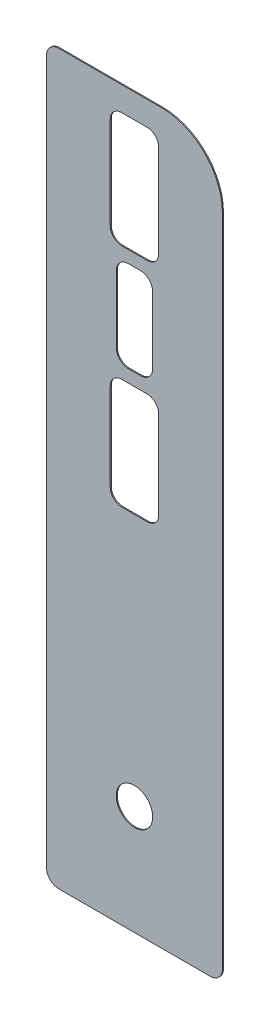
ISO-10303-21;
HEADER;
FILE_DESCRIPTION(('STEP AP214'),'2;1');
FILE_NAME('part.step','',(''),(''),'','','');
FILE_SCHEMA(('AUTOMOTIVE_DESIGN { 1 0 10303 214 1 1 1 1 }'));
ENDSEC;
DATA;
#1=APPLICATION_CONTEXT('core data for automotive mechanical design processes');
#2=APPLICATION_PROTOCOL_DEFINITION('international standard','automotive_design',2000,#1);
#3=PRODUCT_CONTEXT('',#1,'mechanical');
#4=PRODUCT('Part','Part','',(#3));
#5=PRODUCT_RELATED_PRODUCT_CATEGORY('part','',(#4));
#6=PRODUCT_DEFINITION_FORMATION('','',#4);
#7=PRODUCT_DEFINITION_CONTEXT('part definition',#1,'design');
#8=PRODUCT_DEFINITION('design','',#6,#7);
#9=PRODUCT_DEFINITION_SHAPE('','',#8);
#10=(LENGTH_UNIT() NAMED_UNIT(*) SI_UNIT(.MILLI.,.METRE.));
#11=(NAMED_UNIT(*) PLANE_ANGLE_UNIT() SI_UNIT($,.RADIAN.));
#12=(NAMED_UNIT(*) SI_UNIT($,.STERADIAN.) SOLID_ANGLE_UNIT());
#13=UNCERTAINTY_MEASURE_WITH_UNIT(LENGTH_MEASURE(1.E-05),#10,'distance_accuracy_value','');
#14=(GEOMETRIC_REPRESENTATION_CONTEXT(3) GLOBAL_UNCERTAINTY_ASSIGNED_CONTEXT((#13)) GLOBAL_UNIT_ASSIGNED_CONTEXT((#10,
#11,#12)) REPRESENTATION_CONTEXT('',''));
#15=CARTESIAN_POINT('',(0.,0.,0.));
#16=DIRECTION('',(0.,0.,1.));
#17=DIRECTION('',(1.,0.,0.));
#18=AXIS2_PLACEMENT_3D('',#15,#16,#17);
#19=CARTESIAN_POINT('',(12.5,-58.,0.17));
#20=DIRECTION('',(0.,0.,-1.));
#21=DIRECTION('',(-1.,0.,0.));
#22=AXIS2_PLACEMENT_3D('',#19,#20,#21);
#23=CYLINDRICAL_SURFACE('',#22,2.);
#24=CARTESIAN_POINT('',(12.5,-58.,0.));
#25=DIRECTION('',(0.,0.,1.));
#26=DIRECTION('',(1.,0.,0.));
#27=AXIS2_PLACEMENT_3D('',#24,#25,#26);
#28=CIRCLE('',#27,2.);
#29=CARTESIAN_POINT('',(12.5,-60.,0.));
#30=VERTEX_POINT('',#29);
#31=CARTESIAN_POINT('',(14.5,-58.,0.));
#32=VERTEX_POINT('',#31);
#33=EDGE_CURVE('E321',#30,#32,#28,.T.);
#34=ORIENTED_EDGE('',*,*,#33,.T.);
#35=DIRECTION('',(0.,0.,-1.));
#36=VECTOR('',#35,1.);
#37=CARTESIAN_POINT('',(14.5,-58.,0.17));
#38=LINE('',#37,#36);
#39=CARTESIAN_POINT('',(14.5,-58.,0.17));
#40=VERTEX_POINT('',#39);
#41=EDGE_CURVE('E11',#40,#32,#38,.T.);
#42=ORIENTED_EDGE('',*,*,#41,.F.);
#43=CARTESIAN_POINT('',(12.5,-58.,0.17));
#44=DIRECTION('',(0.,0.,1.));
#45=DIRECTION('',(1.,0.,0.));
#46=AXIS2_PLACEMENT_3D('',#43,#44,#45);
#47=CIRCLE('',#46,2.);
#48=CARTESIAN_POINT('',(12.5,-60.,0.17));
#49=VERTEX_POINT('',#48);
#50=EDGE_CURVE('E452',#49,#40,#47,.T.);
#51=ORIENTED_EDGE('',*,*,#50,.F.);
#52=DIRECTION('',(0.,0.,-1.));
#53=VECTOR('',#52,1.);
#54=CARTESIAN_POINT('',(12.5,-60.,0.17));
#55=LINE('',#54,#53);
#56=EDGE_CURVE('E470',#49,#30,#55,.T.);
#57=ORIENTED_EDGE('',*,*,#56,.T.);
#58=EDGE_LOOP('',(#34,#42,#51,#57));
#59=FACE_BOUND('',#58,.T.);
#60=ADVANCED_FACE('F41',(#59),#23,.T.);
#61=CARTESIAN_POINT('',(14.5,50.,0.17));
#62=DIRECTION('',(-1.,0.,0.));
#63=DIRECTION('',(0.,-1.,0.));
#64=AXIS2_PLACEMENT_3D('',#61,#62,#63);
#65=PLANE('',#64);
#66=DIRECTION('',(0.,1.,0.));
#67=VECTOR('',#66,1.);
#68=CARTESIAN_POINT('',(14.5,50.,0.));
#69=LINE('',#68,#67);
#70=CARTESIAN_POINT('',(14.5,50.,0.));
#71=VERTEX_POINT('',#70);
#72=EDGE_CURVE('E473',#32,#71,#69,.T.);
#73=ORIENTED_EDGE('',*,*,#72,.T.);
#74=DIRECTION('',(0.,0.,-1.));
#75=VECTOR('',#74,1.);
#76=CARTESIAN_POINT('',(14.5,50.,0.17));
#77=LINE('',#76,#75);
#78=CARTESIAN_POINT('',(14.5,50.,0.17));
#79=VERTEX_POINT('',#78);
#80=EDGE_CURVE('E48',#79,#71,#77,.T.);
#81=ORIENTED_EDGE('',*,*,#80,.F.);
#82=DIRECTION('',(0.,1.,0.));
#83=VECTOR('',#82,1.);
#84=CARTESIAN_POINT('',(14.5,50.,0.17));
#85=LINE('',#84,#83);
#86=EDGE_CURVE('E455',#40,#79,#85,.T.);
#87=ORIENTED_EDGE('',*,*,#86,.F.);
#88=ORIENTED_EDGE('',*,*,#41,.T.);
#89=EDGE_LOOP('',(#73,#81,#87,#88));
#90=FACE_BOUND('',#89,.T.);
#91=ADVANCED_FACE('F529',(#90),#65,.F.);
#92=CARTESIAN_POINT('',(4.5,50.,0.17));
#93=DIRECTION('',(0.,0.,-1.));
#94=DIRECTION('',(-1.,0.,0.));
#95=AXIS2_PLACEMENT_3D('',#92,#93,#94);
#96=CYLINDRICAL_SURFACE('',#95,10.);
#97=CARTESIAN_POINT('',(4.5,50.,0.));
#98=DIRECTION('',(0.,0.,1.));
#99=DIRECTION('',(-1.,0.,0.));
#100=AXIS2_PLACEMENT_3D('',#97,#98,#99);
#101=CIRCLE('',#100,10.);
#102=CARTESIAN_POINT('',(4.5,60.,0.));
#103=VERTEX_POINT('',#102);
#104=EDGE_CURVE('E475',#71,#103,#101,.T.);
#105=ORIENTED_EDGE('',*,*,#104,.T.);
#106=DIRECTION('',(0.,0.,-1.));
#107=VECTOR('',#106,1.);
#108=CARTESIAN_POINT('',(4.5,60.,0.17));
#109=LINE('',#108,#107);
#110=CARTESIAN_POINT('',(4.5,60.,0.17));
#111=VERTEX_POINT('',#110);
#112=EDGE_CURVE('E500',#111,#103,#109,.T.);
#113=ORIENTED_EDGE('',*,*,#112,.F.);
#114=CARTESIAN_POINT('',(4.5,50.,0.17));
#115=DIRECTION('',(0.,0.,1.));
#116=DIRECTION('',(-1.,0.,0.));
#117=AXIS2_PLACEMENT_3D('',#114,#115,#116);
#118=CIRCLE('',#117,10.);
#119=EDGE_CURVE('E458',#79,#111,#118,.T.);
#120=ORIENTED_EDGE('',*,*,#119,.F.);
#121=ORIENTED_EDGE('',*,*,#80,.T.);
#122=EDGE_LOOP('',(#105,#113,#120,#121));
#123=FACE_BOUND('',#122,.T.);
#124=ADVANCED_FACE('F507',(#123),#96,.T.);
#125=CARTESIAN_POINT('',(-12.5,60.,0.17));
#126=DIRECTION('',(0.,-1.,0.));
#127=DIRECTION('',(1.,0.,0.));
#128=AXIS2_PLACEMENT_3D('',#125,#126,#127);
#129=PLANE('',#128);
#130=DIRECTION('',(-1.,0.,0.));
#131=VECTOR('',#130,1.);
#132=CARTESIAN_POINT('',(-12.5,60.,0.));
#133=LINE('',#132,#131);
#134=CARTESIAN_POINT('',(-12.5,60.,0.));
#135=VERTEX_POINT('',#134);
#136=EDGE_CURVE('E477',#103,#135,#133,.T.);
#137=ORIENTED_EDGE('',*,*,#136,.T.);
#138=DIRECTION('',(0.,0.,-1.));
#139=VECTOR('',#138,1.);
#140=CARTESIAN_POINT('',(-12.5,60.,0.17));
#141=LINE('',#140,#139);
#142=CARTESIAN_POINT('',(-12.5,60.,0.17));
#143=VERTEX_POINT('',#142);
#144=EDGE_CURVE('E497',#143,#135,#141,.T.);
#145=ORIENTED_EDGE('',*,*,#144,.F.);
#146=DIRECTION('',(-1.,0.,0.));
#147=VECTOR('',#146,1.);
#148=CARTESIAN_POINT('',(-12.5,60.,0.17));
#149=LINE('',#148,#147);
#150=EDGE_CURVE('E460',#111,#143,#149,.T.);
#151=ORIENTED_EDGE('',*,*,#150,.F.);
#152=ORIENTED_EDGE('',*,*,#112,.T.);
#153=EDGE_LOOP('',(#137,#145,#151,#152));
#154=FACE_BOUND('',#153,.T.);
#155=ADVANCED_FACE('F517',(#154),#129,.F.);
#156=CARTESIAN_POINT('',(-12.5,58.,0.17));
#157=DIRECTION('',(0.,0.,-1.));
#158=DIRECTION('',(-1.,0.,0.));
#159=AXIS2_PLACEMENT_3D('',#156,#157,#158);
#160=CYLINDRICAL_SURFACE('',#159,2.);
#161=CARTESIAN_POINT('',(-12.5,58.,0.));
#162=DIRECTION('',(0.,0.,1.));
#163=DIRECTION('',(1.,0.,0.));
#164=AXIS2_PLACEMENT_3D('',#161,#162,#163);
#165=CIRCLE('',#164,2.);
#166=CARTESIAN_POINT('',(-14.5,58.,0.));
#167=VERTEX_POINT('',#166);
#168=EDGE_CURVE('E479',#135,#167,#165,.T.);
#169=ORIENTED_EDGE('',*,*,#168,.T.);
#170=DIRECTION('',(0.,0.,-1.));
#171=VECTOR('',#170,1.);
#172=CARTESIAN_POINT('',(-14.5,58.,0.17));
#173=LINE('',#172,#171);
#174=CARTESIAN_POINT('',(-14.5,58.,0.17));
#175=VERTEX_POINT('',#174);
#176=EDGE_CURVE('E494',#175,#167,#173,.T.);
#177=ORIENTED_EDGE('',*,*,#176,.F.);
#178=CARTESIAN_POINT('',(-12.5,58.,0.17));
#179=DIRECTION('',(0.,0.,1.));
#180=DIRECTION('',(1.,0.,0.));
#181=AXIS2_PLACEMENT_3D('',#178,#179,#180);
#182=CIRCLE('',#181,2.);
#183=EDGE_CURVE('E462',#143,#175,#182,.T.);
#184=ORIENTED_EDGE('',*,*,#183,.F.);
#185=ORIENTED_EDGE('',*,*,#144,.T.);
#186=EDGE_LOOP('',(#169,#177,#184,#185));
#187=FACE_BOUND('',#186,.T.);
#188=ADVANCED_FACE('F521',(#187),#160,.T.);
#189=CARTESIAN_POINT('',(-14.5,58.,0.17));
#190=DIRECTION('',(1.,0.,0.));
#191=DIRECTION('',(0.,1.,0.));
#192=AXIS2_PLACEMENT_3D('',#189,#190,#191);
#193=PLANE('',#192);
#194=DIRECTION('',(0.,-1.,0.));
#195=VECTOR('',#194,1.);
#196=CARTESIAN_POINT('',(-14.5,58.,0.));
#197=LINE('',#196,#195);
#198=CARTESIAN_POINT('',(-14.5,-58.,0.));
#199=VERTEX_POINT('',#198);
#200=EDGE_CURVE('E481',#167,#199,#197,.T.);
#201=ORIENTED_EDGE('',*,*,#200,.T.);
#202=DIRECTION('',(0.,0.,-1.));
#203=VECTOR('',#202,1.);
#204=CARTESIAN_POINT('',(-14.5,-58.,0.17));
#205=LINE('',#204,#203);
#206=CARTESIAN_POINT('',(-14.5,-58.,0.17));
#207=VERTEX_POINT('',#206);
#208=EDGE_CURVE('E491',#207,#199,#205,.T.);
#209=ORIENTED_EDGE('',*,*,#208,.F.);
#210=DIRECTION('',(0.,-1.,0.));
#211=VECTOR('',#210,1.);
#212=CARTESIAN_POINT('',(-14.5,58.,0.17));
#213=LINE('',#212,#211);
#214=EDGE_CURVE('E464',#175,#207,#213,.T.);
#215=ORIENTED_EDGE('',*,*,#214,.F.);
#216=ORIENTED_EDGE('',*,*,#176,.T.);
#217=EDGE_LOOP('',(#201,#209,#215,#216));
#218=FACE_BOUND('',#217,.T.);
#219=ADVANCED_FACE('F542',(#218),#193,.F.);
#220=CARTESIAN_POINT('',(-12.5,-58.,0.17));
#221=DIRECTION('',(0.,0.,-1.));
#222=DIRECTION('',(-1.,0.,0.));
#223=AXIS2_PLACEMENT_3D('',#220,#221,#222);
#224=CYLINDRICAL_SURFACE('',#223,2.);
#225=CARTESIAN_POINT('',(-12.5,-58.,0.));
#226=DIRECTION('',(0.,0.,1.));
#227=DIRECTION('',(1.,0.,0.));
#228=AXIS2_PLACEMENT_3D('',#225,#226,#227);
#229=CIRCLE('',#228,2.);
#230=CARTESIAN_POINT('',(-12.5,-60.,0.));
#231=VERTEX_POINT('',#230);
#232=EDGE_CURVE('E483',#199,#231,#229,.T.);
#233=ORIENTED_EDGE('',*,*,#232,.T.);
#234=DIRECTION('',(0.,0.,-1.));
#235=VECTOR('',#234,1.);
#236=CARTESIAN_POINT('',(-12.5,-60.,0.17));
#237=LINE('',#236,#235);
#238=CARTESIAN_POINT('',(-12.5,-60.,0.17));
#239=VERTEX_POINT('',#238);
#240=EDGE_CURVE('E488',#239,#231,#237,.T.);
#241=ORIENTED_EDGE('',*,*,#240,.F.);
#242=CARTESIAN_POINT('',(-12.5,-58.,0.17));
#243=DIRECTION('',(0.,0.,1.));
#244=DIRECTION('',(1.,0.,0.));
#245=AXIS2_PLACEMENT_3D('',#242,#243,#244);
#246=CIRCLE('',#245,2.);
#247=EDGE_CURVE('E466',#207,#239,#246,.T.);
#248=ORIENTED_EDGE('',*,*,#247,.F.);
#249=ORIENTED_EDGE('',*,*,#208,.T.);
#250=EDGE_LOOP('',(#233,#241,#248,#249));
#251=FACE_BOUND('',#250,.T.);
#252=ADVANCED_FACE('F540',(#251),#224,.T.);
#253=CARTESIAN_POINT('',(-12.5,-60.,0.17));
#254=DIRECTION('',(0.,1.,0.));
#255=DIRECTION('',(-1.,0.,0.));
#256=AXIS2_PLACEMENT_3D('',#253,#254,#255);
#257=PLANE('',#256);
#258=DIRECTION('',(1.,0.,0.));
#259=VECTOR('',#258,1.);
#260=CARTESIAN_POINT('',(-12.5,-60.,0.));
#261=LINE('',#260,#259);
#262=EDGE_CURVE('E456',#231,#30,#261,.T.);
#263=ORIENTED_EDGE('',*,*,#262,.T.);
#264=ORIENTED_EDGE('',*,*,#56,.F.);
#265=DIRECTION('',(1.,0.,0.));
#266=VECTOR('',#265,1.);
#267=CARTESIAN_POINT('',(-12.5,-60.,0.17));
#268=LINE('',#267,#266);
#269=EDGE_CURVE('E468',#239,#49,#268,.T.);
#270=ORIENTED_EDGE('',*,*,#269,.F.);
#271=ORIENTED_EDGE('',*,*,#240,.T.);
#272=EDGE_LOOP('',(#263,#264,#270,#271));
#273=FACE_BOUND('',#272,.T.);
#274=ADVANCED_FACE('F535',(#273),#257,.F.);
#275=CARTESIAN_POINT('',(12.5,-58.,0.17));
#276=DIRECTION('',(0.,0.,1.));
#277=DIRECTION('',(1.,0.,0.));
#278=AXIS2_PLACEMENT_3D('',#275,#276,#277);
#279=PLANE('',#278);
#280=CARTESIAN_POINT('',(-1.,32.9999999999978,0.17));
#281=DIRECTION('',(0.,0.,1.));
#282=DIRECTION('',(1.,0.,0.));
#283=AXIS2_PLACEMENT_3D('',#280,#281,#282);
#284=CIRCLE('',#283,2.);
#285=CARTESIAN_POINT('',(-0.999999999999985,34.9999999999978,0.17));
#286=VERTEX_POINT('',#285);
#287=CARTESIAN_POINT('',(-3.,32.9999999999978,0.17));
#288=VERTEX_POINT('',#287);
#289=EDGE_CURVE('E55',#286,#288,#284,.T.);
#290=ORIENTED_EDGE('',*,*,#289,.F.);
#291=DIRECTION('',(-1.,0.,0.));
#292=VECTOR('',#291,1.);
#293=CARTESIAN_POINT('',(0.999999999999986,34.9999999999978,0.17));
#294=LINE('',#293,#292);
#295=CARTESIAN_POINT('',(0.999999999999986,34.9999999999978,0.17));
#296=VERTEX_POINT('',#295);
#297=EDGE_CURVE('E268',#296,#286,#294,.T.);
#298=ORIENTED_EDGE('',*,*,#297,.F.);
#299=CARTESIAN_POINT('',(1.,32.9999999999978,0.17));
#300=DIRECTION('',(0.,0.,1.));
#301=DIRECTION('',(1.,0.,0.));
#302=AXIS2_PLACEMENT_3D('',#299,#300,#301);
#303=CIRCLE('',#302,2.);
#304=CARTESIAN_POINT('',(3.,32.9999999999978,0.17));
#305=VERTEX_POINT('',#304);
#306=EDGE_CURVE('E271',#305,#296,#303,.T.);
#307=ORIENTED_EDGE('',*,*,#306,.F.);
#308=DIRECTION('',(0.,1.,0.));
#309=VECTOR('',#308,1.);
#310=CARTESIAN_POINT('',(3.,22.,0.17));
#311=LINE('',#310,#309);
#312=CARTESIAN_POINT('',(3.,22.,0.17));
#313=VERTEX_POINT('',#312);
#314=EDGE_CURVE('E299',#313,#305,#311,.T.);
#315=ORIENTED_EDGE('',*,*,#314,.F.);
#316=CARTESIAN_POINT('',(1.,22.,0.17));
#317=DIRECTION('',(0.,0.,1.));
#318=DIRECTION('',(1.,0.,0.));
#319=AXIS2_PLACEMENT_3D('',#316,#317,#318);
#320=CIRCLE('',#319,2.);
#321=CARTESIAN_POINT('',(1.,20.,0.17));
#322=VERTEX_POINT('',#321);
#323=EDGE_CURVE('E296',#322,#313,#320,.T.);
#324=ORIENTED_EDGE('',*,*,#323,.F.);
#325=DIRECTION('',(1.,0.,0.));
#326=VECTOR('',#325,1.);
#327=CARTESIAN_POINT('',(-0.999999999999999,20.,0.17));
#328=LINE('',#327,#326);
#329=CARTESIAN_POINT('',(-0.999999999999999,20.,0.17));
#330=VERTEX_POINT('',#329);
#331=EDGE_CURVE('E293',#330,#322,#328,.T.);
#332=ORIENTED_EDGE('',*,*,#331,.F.);
#333=CARTESIAN_POINT('',(-0.999999999999998,22.,0.17));
#334=DIRECTION('',(0.,0.,1.));
#335=DIRECTION('',(1.,0.,0.));
#336=AXIS2_PLACEMENT_3D('',#333,#334,#335);
#337=CIRCLE('',#336,2.);
#338=CARTESIAN_POINT('',(-3.,22.,0.17));
#339=VERTEX_POINT('',#338);
#340=EDGE_CURVE('E290',#339,#330,#337,.T.);
#341=ORIENTED_EDGE('',*,*,#340,.F.);
#342=DIRECTION('',(0.,-1.,0.));
#343=VECTOR('',#342,1.);
#344=CARTESIAN_POINT('',(-3.,32.9999999999978,0.17));
#345=LINE('',#344,#343);
#346=EDGE_CURVE('E288',#288,#339,#345,.T.);
#347=ORIENTED_EDGE('',*,*,#346,.F.);
#348=EDGE_LOOP('',(#290,#298,#307,#315,#324,#332,#341,#347));
#349=FACE_BOUND('',#348,.T.);
#350=CARTESIAN_POINT('',(0.,-42.,0.17));
#351=DIRECTION('',(0.,0.,1.));
#352=DIRECTION('',(1.,0.,0.));
#353=AXIS2_PLACEMENT_3D('',#350,#351,#352);
#354=CIRCLE('',#353,3.);
#355=CARTESIAN_POINT('',(3.,-42.,0.17));
#356=VERTEX_POINT('',#355);
#357=EDGE_CURVE('E322',#356,#356,#354,.T.);
#358=ORIENTED_EDGE('',*,*,#357,.F.);
#359=EDGE_LOOP('',(#358));
#360=FACE_BOUND('',#359,.T.);
#361=CARTESIAN_POINT('',(2.10000000000001,1.6,0.17));
#362=DIRECTION('',(0.,0.,1.));
#363=DIRECTION('',(1.,0.,0.));
#364=AXIS2_PLACEMENT_3D('',#361,#362,#363);
#365=CIRCLE('',#364,1.9);
#366=CARTESIAN_POINT('',(2.10000000000001,-0.3,0.17));
#367=VERTEX_POINT('',#366);
#368=CARTESIAN_POINT('',(4.00000000000001,1.6,0.17));
#369=VERTEX_POINT('',#368);
#370=EDGE_CURVE('E325',#367,#369,#365,.T.);
#371=ORIENTED_EDGE('',*,*,#370,.F.);
#372=DIRECTION('',(1.,0.,0.));
#373=VECTOR('',#372,1.);
#374=CARTESIAN_POINT('',(-2.1,-0.3,0.17));
#375=LINE('',#374,#373);
#376=CARTESIAN_POINT('',(-2.1,-0.3,0.17));
#377=VERTEX_POINT('',#376);
#378=EDGE_CURVE('E345',#377,#367,#375,.T.);
#379=ORIENTED_EDGE('',*,*,#378,.F.);
#380=CARTESIAN_POINT('',(-2.1,1.6,0.17));
#381=DIRECTION('',(0.,0.,1.));
#382=DIRECTION('',(1.,0.,0.));
#383=AXIS2_PLACEMENT_3D('',#380,#381,#382);
#384=CIRCLE('',#383,1.9);
#385=CARTESIAN_POINT('',(-3.99999999999999,1.6,0.17));
#386=VERTEX_POINT('',#385);
#387=EDGE_CURVE('E348',#386,#377,#384,.T.);
#388=ORIENTED_EDGE('',*,*,#387,.F.);
#389=DIRECTION('',(0.,-1.,0.));
#390=VECTOR('',#389,1.);
#391=CARTESIAN_POINT('',(-4.,16.0318297738409,0.17));
#392=LINE('',#391,#390);
#393=CARTESIAN_POINT('',(-4.,16.0318297738409,0.17));
#394=VERTEX_POINT('',#393);
#395=EDGE_CURVE('E352',#394,#386,#392,.T.);
#396=ORIENTED_EDGE('',*,*,#395,.F.);
#397=CARTESIAN_POINT('',(-2.1,16.0318297738409,0.17));
#398=DIRECTION('',(0.,0.,1.));
#399=DIRECTION('',(1.,0.,0.));
#400=AXIS2_PLACEMENT_3D('',#397,#398,#399);
#401=CIRCLE('',#400,1.9);
#402=CARTESIAN_POINT('',(-2.1,17.9318297738409,0.17));
#403=VERTEX_POINT('',#402);
#404=EDGE_CURVE('E355',#403,#394,#401,.T.);
#405=ORIENTED_EDGE('',*,*,#404,.F.);
#406=DIRECTION('',(-1.,0.,0.));
#407=VECTOR('',#406,1.);
#408=CARTESIAN_POINT('',(2.10000000000001,17.9318297738409,0.17));
#409=LINE('',#408,#407);
#410=CARTESIAN_POINT('',(2.10000000000001,17.9318297738409,0.17));
#411=VERTEX_POINT('',#410);
#412=EDGE_CURVE('E358',#411,#403,#409,.T.);
#413=ORIENTED_EDGE('',*,*,#412,.F.);
#414=CARTESIAN_POINT('',(2.10000000000001,16.0318297738409,0.17));
#415=DIRECTION('',(0.,0.,1.));
#416=DIRECTION('',(1.,0.,0.));
#417=AXIS2_PLACEMENT_3D('',#414,#415,#416);
#418=CIRCLE('',#417,1.9);
#419=CARTESIAN_POINT('',(4.00000000000001,16.0318297738409,0.17));
#420=VERTEX_POINT('',#419);
#421=EDGE_CURVE('E361',#420,#411,#418,.T.);
#422=ORIENTED_EDGE('',*,*,#421,.F.);
#423=DIRECTION('',(0.,1.,0.));
#424=VECTOR('',#423,1.);
#425=CARTESIAN_POINT('',(4.00000000000001,1.6,0.17));
#426=LINE('',#425,#424);
#427=EDGE_CURVE('E364',#369,#420,#426,.T.);
#428=ORIENTED_EDGE('',*,*,#427,.F.);
#429=EDGE_LOOP('',(#371,#379,#388,#396,#405,#413,#422,#428));
#430=FACE_BOUND('',#429,.T.);
#431=CARTESIAN_POINT('',(2.1,54.1000000000022,0.17));
#432=DIRECTION('',(0.,0.,1.));
#433=DIRECTION('',(1.,0.,0.));
#434=AXIS2_PLACEMENT_3D('',#431,#432,#433);
#435=CIRCLE('',#434,1.9);
#436=CARTESIAN_POINT('',(4.00000000000001,54.1000000000022,0.17));
#437=VERTEX_POINT('',#436);
#438=CARTESIAN_POINT('',(2.1,56.0000000000022,0.17));
#439=VERTEX_POINT('',#438);
#440=EDGE_CURVE('E344',#437,#439,#435,.T.);
#441=ORIENTED_EDGE('',*,*,#440,.F.);
#442=DIRECTION('',(0.,1.,0.));
#443=VECTOR('',#442,1.);
#444=CARTESIAN_POINT('',(4.00000000000001,38.8999999999978,0.17));
#445=LINE('',#444,#443);
#446=CARTESIAN_POINT('',(4.,38.8999999999978,0.17));
#447=VERTEX_POINT('',#446);
#448=EDGE_CURVE('E407',#447,#437,#445,.T.);
#449=ORIENTED_EDGE('',*,*,#448,.F.);
#450=CARTESIAN_POINT('',(2.1,38.8999999999978,0.17));
#451=DIRECTION('',(0.,0.,1.));
#452=DIRECTION('',(1.,0.,0.));
#453=AXIS2_PLACEMENT_3D('',#450,#451,#452);
#454=CIRCLE('',#453,1.9);
#455=CARTESIAN_POINT('',(2.1,36.9999999999978,0.17));
#456=VERTEX_POINT('',#455);
#457=EDGE_CURVE('E410',#456,#447,#454,.T.);
#458=ORIENTED_EDGE('',*,*,#457,.F.);
#459=DIRECTION('',(1.,0.,0.));
#460=VECTOR('',#459,1.);
#461=CARTESIAN_POINT('',(-2.1,36.9999999999978,0.17));
#462=LINE('',#461,#460);
#463=CARTESIAN_POINT('',(-2.1,36.9999999999978,0.17));
#464=VERTEX_POINT('',#463);
#465=EDGE_CURVE('E414',#464,#456,#462,.T.);
#466=ORIENTED_EDGE('',*,*,#465,.F.);
#467=CARTESIAN_POINT('',(-2.1,38.8999999999978,0.17));
#468=DIRECTION('',(0.,0.,1.));
#469=DIRECTION('',(1.,0.,0.));
#470=AXIS2_PLACEMENT_3D('',#467,#468,#469);
#471=CIRCLE('',#470,1.9);
#472=CARTESIAN_POINT('',(-4.,38.8999999999978,0.17));
#473=VERTEX_POINT('',#472);
#474=EDGE_CURVE('E417',#473,#464,#471,.T.);
#475=ORIENTED_EDGE('',*,*,#474,.F.);
#476=DIRECTION('',(0.,-1.,0.));
#477=VECTOR('',#476,1.);
#478=CARTESIAN_POINT('',(-4.,54.1000000000022,0.17));
#479=LINE('',#478,#477);
#480=CARTESIAN_POINT('',(-4.,54.1000000000022,0.17));
#481=VERTEX_POINT('',#480);
#482=EDGE_CURVE('E420',#481,#473,#479,.T.);
#483=ORIENTED_EDGE('',*,*,#482,.F.);
#484=CARTESIAN_POINT('',(-2.1,54.1000000000022,0.17));
#485=DIRECTION('',(0.,0.,1.));
#486=DIRECTION('',(1.,0.,0.));
#487=AXIS2_PLACEMENT_3D('',#484,#485,#486);
#488=CIRCLE('',#487,1.9);
#489=CARTESIAN_POINT('',(-2.1,56.0000000000022,0.17));
#490=VERTEX_POINT('',#489);
#491=EDGE_CURVE('E423',#490,#481,#488,.T.);
#492=ORIENTED_EDGE('',*,*,#491,.F.);
#493=DIRECTION('',(-1.,0.,0.));
#494=VECTOR('',#493,1.);
#495=CARTESIAN_POINT('',(2.1,56.0000000000022,0.17));
#496=LINE('',#495,#494);
#497=EDGE_CURVE('E426',#439,#490,#496,.T.);
#498=ORIENTED_EDGE('',*,*,#497,.F.);
#499=EDGE_LOOP('',(#441,#449,#458,#466,#475,#483,#492,#498));
#500=FACE_BOUND('',#499,.T.);
#501=ORIENTED_EDGE('',*,*,#50,.T.);
#502=ORIENTED_EDGE('',*,*,#86,.T.);
#503=ORIENTED_EDGE('',*,*,#119,.T.);
#504=ORIENTED_EDGE('',*,*,#150,.T.);
#505=ORIENTED_EDGE('',*,*,#183,.T.);
#506=ORIENTED_EDGE('',*,*,#214,.T.);
#507=ORIENTED_EDGE('',*,*,#247,.T.);
#508=ORIENTED_EDGE('',*,*,#269,.T.);
#509=EDGE_LOOP('',(#501,#502,#503,#504,#505,#506,#507,#508));
#510=FACE_BOUND('',#509,.T.);
#511=ADVANCED_FACE('F525',(#349,#360,#430,#500,#510),#279,.T.);
#512=CARTESIAN_POINT('',(12.5,-58.,0.));
#513=DIRECTION('',(0.,0.,1.));
#514=DIRECTION('',(1.,0.,0.));
#515=AXIS2_PLACEMENT_3D('',#512,#513,#514);
#516=PLANE('',#515);
#517=DIRECTION('',(-1.,0.,0.));
#518=VECTOR('',#517,1.);
#519=CARTESIAN_POINT('',(0.999999999999986,34.9999999999978,0.));
#520=LINE('',#519,#518);
#521=CARTESIAN_POINT('',(0.999999999999986,34.9999999999978,0.));
#522=VERTEX_POINT('',#521);
#523=CARTESIAN_POINT('',(-0.999999999999985,34.9999999999978,0.));
#524=VERTEX_POINT('',#523);
#525=EDGE_CURVE('E257',#522,#524,#520,.T.);
#526=ORIENTED_EDGE('',*,*,#525,.T.);
#527=CARTESIAN_POINT('',(-1.,32.9999999999978,0.));
#528=DIRECTION('',(0.,0.,1.));
#529=DIRECTION('',(1.,0.,0.));
#530=AXIS2_PLACEMENT_3D('',#527,#528,#529);
#531=CIRCLE('',#530,2.);
#532=CARTESIAN_POINT('',(-3.,32.9999999999978,0.));
#533=VERTEX_POINT('',#532);
#534=EDGE_CURVE('E251',#524,#533,#531,.T.);
#535=ORIENTED_EDGE('',*,*,#534,.T.);
#536=DIRECTION('',(0.,-1.,0.));
#537=VECTOR('',#536,1.);
#538=CARTESIAN_POINT('',(-3.,32.9999999999978,0.));
#539=LINE('',#538,#537);
#540=CARTESIAN_POINT('',(-3.,22.,0.));
#541=VERTEX_POINT('',#540);
#542=EDGE_CURVE('E260',#533,#541,#539,.T.);
#543=ORIENTED_EDGE('',*,*,#542,.T.);
#544=CARTESIAN_POINT('',(-0.999999999999998,22.,0.));
#545=DIRECTION('',(0.,0.,1.));
#546=DIRECTION('',(1.,0.,0.));
#547=AXIS2_PLACEMENT_3D('',#544,#545,#546);
#548=CIRCLE('',#547,2.);
#549=CARTESIAN_POINT('',(-0.999999999999999,20.,0.));
#550=VERTEX_POINT('',#549);
#551=EDGE_CURVE('E63',#541,#550,#548,.T.);
#552=ORIENTED_EDGE('',*,*,#551,.T.);
#553=DIRECTION('',(1.,0.,0.));
#554=VECTOR('',#553,1.);
#555=CARTESIAN_POINT('',(-0.999999999999999,20.,0.));
#556=LINE('',#555,#554);
#557=CARTESIAN_POINT('',(1.,20.,0.));
#558=VERTEX_POINT('',#557);
#559=EDGE_CURVE('E275',#550,#558,#556,.T.);
#560=ORIENTED_EDGE('',*,*,#559,.T.);
#561=CARTESIAN_POINT('',(1.,22.,0.));
#562=DIRECTION('',(0.,0.,1.));
#563=DIRECTION('',(1.,0.,0.));
#564=AXIS2_PLACEMENT_3D('',#561,#562,#563);
#565=CIRCLE('',#564,2.);
#566=CARTESIAN_POINT('',(3.,22.,0.));
#567=VERTEX_POINT('',#566);
#568=EDGE_CURVE('E278',#558,#567,#565,.T.);
#569=ORIENTED_EDGE('',*,*,#568,.T.);
#570=DIRECTION('',(0.,1.,0.));
#571=VECTOR('',#570,1.);
#572=CARTESIAN_POINT('',(3.,22.,0.));
#573=LINE('',#572,#571);
#574=CARTESIAN_POINT('',(3.,32.9999999999978,0.));
#575=VERTEX_POINT('',#574);
#576=EDGE_CURVE('E281',#567,#575,#573,.T.);
#577=ORIENTED_EDGE('',*,*,#576,.T.);
#578=CARTESIAN_POINT('',(1.,32.9999999999978,0.));
#579=DIRECTION('',(0.,0.,1.));
#580=DIRECTION('',(1.,0.,0.));
#581=AXIS2_PLACEMENT_3D('',#578,#579,#580);
#582=CIRCLE('',#581,2.);
#583=EDGE_CURVE('E284',#575,#522,#582,.T.);
#584=ORIENTED_EDGE('',*,*,#583,.T.);
#585=EDGE_LOOP('',(#526,#535,#543,#552,#560,#569,#577,#584));
#586=FACE_BOUND('',#585,.T.);
#587=CARTESIAN_POINT('',(0.,-42.,0.));
#588=DIRECTION('',(0.,0.,1.));
#589=DIRECTION('',(1.,0.,0.));
#590=AXIS2_PLACEMENT_3D('',#587,#588,#589);
#591=CIRCLE('',#590,3.);
#592=CARTESIAN_POINT('',(3.,-42.,0.));
#593=VERTEX_POINT('',#592);
#594=EDGE_CURVE('E318',#593,#593,#591,.T.);
#595=ORIENTED_EDGE('',*,*,#594,.T.);
#596=EDGE_LOOP('',(#595));
#597=FACE_BOUND('',#596,.T.);
#598=DIRECTION('',(1.,0.,0.));
#599=VECTOR('',#598,1.);
#600=CARTESIAN_POINT('',(-2.1,-0.3,0.));
#601=LINE('',#600,#599);
#602=CARTESIAN_POINT('',(-2.1,-0.3,0.));
#603=VERTEX_POINT('',#602);
#604=CARTESIAN_POINT('',(2.10000000000001,-0.3,0.));
#605=VERTEX_POINT('',#604);
#606=EDGE_CURVE('E329',#603,#605,#601,.T.);
#607=ORIENTED_EDGE('',*,*,#606,.T.);
#608=CARTESIAN_POINT('',(2.10000000000001,1.6,0.));
#609=DIRECTION('',(0.,0.,1.));
#610=DIRECTION('',(1.,0.,0.));
#611=AXIS2_PLACEMENT_3D('',#608,#609,#610);
#612=CIRCLE('',#611,1.9);
#613=CARTESIAN_POINT('',(4.00000000000001,1.6,0.));
#614=VERTEX_POINT('',#613);
#615=EDGE_CURVE('E349',#605,#614,#612,.T.);
#616=ORIENTED_EDGE('',*,*,#615,.T.);
#617=DIRECTION('',(0.,1.,0.));
#618=VECTOR('',#617,1.);
#619=CARTESIAN_POINT('',(4.00000000000001,1.6,0.));
#620=LINE('',#619,#618);
#621=CARTESIAN_POINT('',(4.00000000000001,16.0318297738409,0.));
#622=VERTEX_POINT('',#621);
#623=EDGE_CURVE('E385',#614,#622,#620,.T.);
#624=ORIENTED_EDGE('',*,*,#623,.T.);
#625=CARTESIAN_POINT('',(2.10000000000001,16.0318297738409,0.));
#626=DIRECTION('',(0.,0.,1.));
#627=DIRECTION('',(1.,0.,0.));
#628=AXIS2_PLACEMENT_3D('',#625,#626,#627);
#629=CIRCLE('',#628,1.9);
#630=CARTESIAN_POINT('',(2.10000000000001,17.9318297738409,0.));
#631=VERTEX_POINT('',#630);
#632=EDGE_CURVE('E382',#622,#631,#629,.T.);
#633=ORIENTED_EDGE('',*,*,#632,.T.);
#634=DIRECTION('',(-1.,0.,0.));
#635=VECTOR('',#634,1.);
#636=CARTESIAN_POINT('',(2.10000000000001,17.9318297738409,0.));
#637=LINE('',#636,#635);
#638=CARTESIAN_POINT('',(-2.1,17.9318297738409,0.));
#639=VERTEX_POINT('',#638);
#640=EDGE_CURVE('E379',#631,#639,#637,.T.);
#641=ORIENTED_EDGE('',*,*,#640,.T.);
#642=CARTESIAN_POINT('',(-2.1,16.0318297738409,0.));
#643=DIRECTION('',(0.,0.,1.));
#644=DIRECTION('',(1.,0.,0.));
#645=AXIS2_PLACEMENT_3D('',#642,#643,#644);
#646=CIRCLE('',#645,1.9);
#647=CARTESIAN_POINT('',(-4.,16.0318297738409,0.));
#648=VERTEX_POINT('',#647);
#649=EDGE_CURVE('E376',#639,#648,#646,.T.);
#650=ORIENTED_EDGE('',*,*,#649,.T.);
#651=DIRECTION('',(0.,-1.,0.));
#652=VECTOR('',#651,1.);
#653=CARTESIAN_POINT('',(-4.,16.0318297738409,0.));
#654=LINE('',#653,#652);
#655=CARTESIAN_POINT('',(-3.99999999999999,1.6,0.));
#656=VERTEX_POINT('',#655);
#657=EDGE_CURVE('E373',#648,#656,#654,.T.);
#658=ORIENTED_EDGE('',*,*,#657,.T.);
#659=CARTESIAN_POINT('',(-2.1,1.6,0.));
#660=DIRECTION('',(0.,0.,1.));
#661=DIRECTION('',(1.,0.,0.));
#662=AXIS2_PLACEMENT_3D('',#659,#660,#661);
#663=CIRCLE('',#662,1.9);
#664=EDGE_CURVE('E370',#656,#603,#663,.T.);
#665=ORIENTED_EDGE('',*,*,#664,.T.);
#666=EDGE_LOOP('',(#607,#616,#624,#633,#641,#650,#658,#665));
#667=FACE_BOUND('',#666,.T.);
#668=DIRECTION('',(0.,1.,0.));
#669=VECTOR('',#668,1.);
#670=CARTESIAN_POINT('',(4.00000000000001,38.8999999999978,0.));
#671=LINE('',#670,#669);
#672=CARTESIAN_POINT('',(4.,38.8999999999978,0.));
#673=VERTEX_POINT('',#672);
#674=CARTESIAN_POINT('',(4.00000000000001,54.1000000000022,0.));
#675=VERTEX_POINT('',#674);
#676=EDGE_CURVE('E393',#673,#675,#671,.T.);
#677=ORIENTED_EDGE('',*,*,#676,.T.);
#678=CARTESIAN_POINT('',(2.1,54.1000000000022,0.));
#679=DIRECTION('',(0.,0.,1.));
#680=DIRECTION('',(1.,0.,0.));
#681=AXIS2_PLACEMENT_3D('',#678,#679,#680);
#682=CIRCLE('',#681,1.9);
#683=CARTESIAN_POINT('',(2.1,56.0000000000022,0.));
#684=VERTEX_POINT('',#683);
#685=EDGE_CURVE('E411',#675,#684,#682,.T.);
#686=ORIENTED_EDGE('',*,*,#685,.T.);
#687=DIRECTION('',(-1.,0.,0.));
#688=VECTOR('',#687,1.);
#689=CARTESIAN_POINT('',(2.1,56.0000000000022,0.));
#690=LINE('',#689,#688);
#691=CARTESIAN_POINT('',(-2.1,56.0000000000022,0.));
#692=VERTEX_POINT('',#691);
#693=EDGE_CURVE('E447',#684,#692,#690,.T.);
#694=ORIENTED_EDGE('',*,*,#693,.T.);
#695=CARTESIAN_POINT('',(-2.1,54.1000000000022,0.));
#696=DIRECTION('',(0.,0.,1.));
#697=DIRECTION('',(1.,0.,0.));
#698=AXIS2_PLACEMENT_3D('',#695,#696,#697);
#699=CIRCLE('',#698,1.9);
#700=CARTESIAN_POINT('',(-4.,54.1000000000022,0.));
#701=VERTEX_POINT('',#700);
#702=EDGE_CURVE('E444',#692,#701,#699,.T.);
#703=ORIENTED_EDGE('',*,*,#702,.T.);
#704=DIRECTION('',(0.,-1.,0.));
#705=VECTOR('',#704,1.);
#706=CARTESIAN_POINT('',(-4.,54.1000000000022,0.));
#707=LINE('',#706,#705);
#708=CARTESIAN_POINT('',(-4.,38.8999999999978,0.));
#709=VERTEX_POINT('',#708);
#710=EDGE_CURVE('E441',#701,#709,#707,.T.);
#711=ORIENTED_EDGE('',*,*,#710,.T.);
#712=CARTESIAN_POINT('',(-2.1,38.8999999999978,0.));
#713=DIRECTION('',(0.,0.,1.));
#714=DIRECTION('',(1.,0.,0.));
#715=AXIS2_PLACEMENT_3D('',#712,#713,#714);
#716=CIRCLE('',#715,1.9);
#717=CARTESIAN_POINT('',(-2.1,36.9999999999978,0.));
#718=VERTEX_POINT('',#717);
#719=EDGE_CURVE('E438',#709,#718,#716,.T.);
#720=ORIENTED_EDGE('',*,*,#719,.T.);
#721=DIRECTION('',(1.,0.,0.));
#722=VECTOR('',#721,1.);
#723=CARTESIAN_POINT('',(-2.1,36.9999999999978,0.));
#724=LINE('',#723,#722);
#725=CARTESIAN_POINT('',(2.1,36.9999999999978,0.));
#726=VERTEX_POINT('',#725);
#727=EDGE_CURVE('E435',#718,#726,#724,.T.);
#728=ORIENTED_EDGE('',*,*,#727,.T.);
#729=CARTESIAN_POINT('',(2.1,38.8999999999978,0.));
#730=DIRECTION('',(0.,0.,1.));
#731=DIRECTION('',(1.,0.,0.));
#732=AXIS2_PLACEMENT_3D('',#729,#730,#731);
#733=CIRCLE('',#732,1.9);
#734=EDGE_CURVE('E432',#726,#673,#733,.T.);
#735=ORIENTED_EDGE('',*,*,#734,.T.);
#736=EDGE_LOOP('',(#677,#686,#694,#703,#711,#720,#728,#735));
#737=FACE_BOUND('',#736,.T.);
#738=ORIENTED_EDGE('',*,*,#33,.F.);
#739=ORIENTED_EDGE('',*,*,#262,.F.);
#740=ORIENTED_EDGE('',*,*,#232,.F.);
#741=ORIENTED_EDGE('',*,*,#200,.F.);
#742=ORIENTED_EDGE('',*,*,#168,.F.);
#743=ORIENTED_EDGE('',*,*,#136,.F.);
#744=ORIENTED_EDGE('',*,*,#104,.F.);
#745=ORIENTED_EDGE('',*,*,#72,.F.);
#746=EDGE_LOOP('',(#738,#739,#740,#741,#742,#743,#744,#745));
#747=FACE_BOUND('',#746,.T.);
#748=ADVANCED_FACE('F264',(#586,#597,#667,#737,#747),#516,.F.);
#749=CARTESIAN_POINT('',(2.1,54.1000000000022,0.));
#750=DIRECTION('',(0.,0.,1.));
#751=DIRECTION('',(1.,0.,0.));
#752=AXIS2_PLACEMENT_3D('',#749,#750,#751);
#753=CYLINDRICAL_SURFACE('',#752,1.9);
#754=ORIENTED_EDGE('',*,*,#440,.T.);
#755=DIRECTION('',(0.,0.,1.));
#756=VECTOR('',#755,1.);
#757=CARTESIAN_POINT('',(2.1,56.0000000000022,0.));
#758=LINE('',#757,#756);
#759=EDGE_CURVE('E390',#684,#439,#758,.T.);
#760=ORIENTED_EDGE('',*,*,#759,.F.);
#761=ORIENTED_EDGE('',*,*,#685,.F.);
#762=DIRECTION('',(0.,0.,1.));
#763=VECTOR('',#762,1.);
#764=CARTESIAN_POINT('',(4.00000000000001,54.1000000000022,0.));
#765=LINE('',#764,#763);
#766=EDGE_CURVE('E306',#675,#437,#765,.T.);
#767=ORIENTED_EDGE('',*,*,#766,.T.);
#768=EDGE_LOOP('',(#754,#760,#761,#767));
#769=FACE_BOUND('',#768,.T.);
#770=ADVANCED_FACE('F609',(#769),#753,.F.);
#771=CARTESIAN_POINT('',(4.00000000000001,38.8999999999978,0.));
#772=DIRECTION('',(1.,0.,0.));
#773=DIRECTION('',(0.,0.,-1.));
#774=AXIS2_PLACEMENT_3D('',#771,#772,#773);
#775=PLANE('',#774);
#776=ORIENTED_EDGE('',*,*,#448,.T.);
#777=ORIENTED_EDGE('',*,*,#766,.F.);
#778=ORIENTED_EDGE('',*,*,#676,.F.);
#779=DIRECTION('',(0.,0.,1.));
#780=VECTOR('',#779,1.);
#781=CARTESIAN_POINT('',(4.,38.8999999999978,0.));
#782=LINE('',#781,#780);
#783=EDGE_CURVE('E404',#673,#447,#782,.T.);
#784=ORIENTED_EDGE('',*,*,#783,.T.);
#785=EDGE_LOOP('',(#776,#777,#778,#784));
#786=FACE_BOUND('',#785,.T.);
#787=ADVANCED_FACE('F618',(#786),#775,.F.);
#788=CARTESIAN_POINT('',(2.1,38.8999999999978,0.));
#789=DIRECTION('',(0.,0.,1.));
#790=DIRECTION('',(1.,0.,0.));
#791=AXIS2_PLACEMENT_3D('',#788,#789,#790);
#792=CYLINDRICAL_SURFACE('',#791,1.9);
#793=ORIENTED_EDGE('',*,*,#457,.T.);
#794=ORIENTED_EDGE('',*,*,#783,.F.);
#795=ORIENTED_EDGE('',*,*,#734,.F.);
#796=DIRECTION('',(0.,0.,1.));
#797=VECTOR('',#796,1.);
#798=CARTESIAN_POINT('',(2.1,36.9999999999978,0.));
#799=LINE('',#798,#797);
#800=EDGE_CURVE('E402',#726,#456,#799,.T.);
#801=ORIENTED_EDGE('',*,*,#800,.T.);
#802=EDGE_LOOP('',(#793,#794,#795,#801));
#803=FACE_BOUND('',#802,.T.);
#804=ADVANCED_FACE('F628',(#803),#792,.F.);
#805=CARTESIAN_POINT('',(-2.1,36.9999999999978,0.));
#806=DIRECTION('',(0.,-1.,0.));
#807=DIRECTION('',(0.,0.,-1.));
#808=AXIS2_PLACEMENT_3D('',#805,#806,#807);
#809=PLANE('',#808);
#810=ORIENTED_EDGE('',*,*,#465,.T.);
#811=ORIENTED_EDGE('',*,*,#800,.F.);
#812=ORIENTED_EDGE('',*,*,#727,.F.);
#813=DIRECTION('',(0.,0.,1.));
#814=VECTOR('',#813,1.);
#815=CARTESIAN_POINT('',(-2.1,36.9999999999978,0.));
#816=LINE('',#815,#814);
#817=EDGE_CURVE('E400',#718,#464,#816,.T.);
#818=ORIENTED_EDGE('',*,*,#817,.T.);
#819=EDGE_LOOP('',(#810,#811,#812,#818));
#820=FACE_BOUND('',#819,.T.);
#821=ADVANCED_FACE('F638',(#820),#809,.F.);
#822=CARTESIAN_POINT('',(-2.1,38.8999999999978,0.));
#823=DIRECTION('',(0.,0.,1.));
#824=DIRECTION('',(1.,0.,0.));
#825=AXIS2_PLACEMENT_3D('',#822,#823,#824);
#826=CYLINDRICAL_SURFACE('',#825,1.9);
#827=ORIENTED_EDGE('',*,*,#474,.T.);
#828=ORIENTED_EDGE('',*,*,#817,.F.);
#829=ORIENTED_EDGE('',*,*,#719,.F.);
#830=DIRECTION('',(0.,0.,1.));
#831=VECTOR('',#830,1.);
#832=CARTESIAN_POINT('',(-4.,38.8999999999978,0.));
#833=LINE('',#832,#831);
#834=EDGE_CURVE('E398',#709,#473,#833,.T.);
#835=ORIENTED_EDGE('',*,*,#834,.T.);
#836=EDGE_LOOP('',(#827,#828,#829,#835));
#837=FACE_BOUND('',#836,.T.);
#838=ADVANCED_FACE('F648',(#837),#826,.F.);
#839=CARTESIAN_POINT('',(-4.,54.1000000000022,0.));
#840=DIRECTION('',(-1.,0.,0.));
#841=DIRECTION('',(0.,-1.,0.));
#842=AXIS2_PLACEMENT_3D('',#839,#840,#841);
#843=PLANE('',#842);
#844=ORIENTED_EDGE('',*,*,#482,.T.);
#845=ORIENTED_EDGE('',*,*,#834,.F.);
#846=ORIENTED_EDGE('',*,*,#710,.F.);
#847=DIRECTION('',(0.,0.,1.));
#848=VECTOR('',#847,1.);
#849=CARTESIAN_POINT('',(-4.,54.1000000000022,0.));
#850=LINE('',#849,#848);
#851=EDGE_CURVE('E396',#701,#481,#850,.T.);
#852=ORIENTED_EDGE('',*,*,#851,.T.);
#853=EDGE_LOOP('',(#844,#845,#846,#852));
#854=FACE_BOUND('',#853,.T.);
#855=ADVANCED_FACE('F658',(#854),#843,.F.);
#856=CARTESIAN_POINT('',(-2.1,54.1000000000022,0.));
#857=DIRECTION('',(0.,0.,1.));
#858=DIRECTION('',(1.,0.,0.));
#859=AXIS2_PLACEMENT_3D('',#856,#857,#858);
#860=CYLINDRICAL_SURFACE('',#859,1.9);
#861=ORIENTED_EDGE('',*,*,#491,.T.);
#862=ORIENTED_EDGE('',*,*,#851,.F.);
#863=ORIENTED_EDGE('',*,*,#702,.F.);
#864=DIRECTION('',(0.,0.,1.));
#865=VECTOR('',#864,1.);
#866=CARTESIAN_POINT('',(-2.1,56.0000000000022,0.));
#867=LINE('',#866,#865);
#868=EDGE_CURVE('E394',#692,#490,#867,.T.);
#869=ORIENTED_EDGE('',*,*,#868,.T.);
#870=EDGE_LOOP('',(#861,#862,#863,#869));
#871=FACE_BOUND('',#870,.T.);
#872=ADVANCED_FACE('F668',(#871),#860,.F.);
#873=CARTESIAN_POINT('',(2.1,56.0000000000022,0.));
#874=DIRECTION('',(0.,1.,0.));
#875=DIRECTION('',(-1.,0.,0.));
#876=AXIS2_PLACEMENT_3D('',#873,#874,#875);
#877=PLANE('',#876);
#878=ORIENTED_EDGE('',*,*,#497,.T.);
#879=ORIENTED_EDGE('',*,*,#868,.F.);
#880=ORIENTED_EDGE('',*,*,#693,.F.);
#881=ORIENTED_EDGE('',*,*,#759,.T.);
#882=EDGE_LOOP('',(#878,#879,#880,#881));
#883=FACE_BOUND('',#882,.T.);
#884=ADVANCED_FACE('F678',(#883),#877,.F.);
#885=CARTESIAN_POINT('',(2.10000000000001,1.6,0.));
#886=DIRECTION('',(0.,0.,1.));
#887=DIRECTION('',(1.,0.,0.));
#888=AXIS2_PLACEMENT_3D('',#885,#886,#887);
#889=CYLINDRICAL_SURFACE('',#888,1.9);
#890=ORIENTED_EDGE('',*,*,#370,.T.);
#891=DIRECTION('',(0.,0.,1.));
#892=VECTOR('',#891,1.);
#893=CARTESIAN_POINT('',(4.00000000000001,1.6,0.));
#894=LINE('',#893,#892);
#895=EDGE_CURVE('E326',#614,#369,#894,.T.);
#896=ORIENTED_EDGE('',*,*,#895,.F.);
#897=ORIENTED_EDGE('',*,*,#615,.F.);
#898=DIRECTION('',(0.,0.,1.));
#899=VECTOR('',#898,1.);
#900=CARTESIAN_POINT('',(2.10000000000001,-0.3,0.));
#901=LINE('',#900,#899);
#902=EDGE_CURVE('E342',#605,#367,#901,.T.);
#903=ORIENTED_EDGE('',*,*,#902,.T.);
#904=EDGE_LOOP('',(#890,#896,#897,#903));
#905=FACE_BOUND('',#904,.T.);
#906=ADVANCED_FACE('F688',(#905),#889,.F.);
#907=CARTESIAN_POINT('',(-2.1,-0.3,0.));
#908=DIRECTION('',(0.,-1.,0.));
#909=DIRECTION('',(1.,0.,0.));
#910=AXIS2_PLACEMENT_3D('',#907,#908,#909);
#911=PLANE('',#910);
#912=ORIENTED_EDGE('',*,*,#378,.T.);
#913=ORIENTED_EDGE('',*,*,#902,.F.);
#914=ORIENTED_EDGE('',*,*,#606,.F.);
#915=DIRECTION('',(0.,0.,1.));
#916=VECTOR('',#915,1.);
#917=CARTESIAN_POINT('',(-2.1,-0.3,0.));
#918=LINE('',#917,#916);
#919=EDGE_CURVE('E340',#603,#377,#918,.T.);
#920=ORIENTED_EDGE('',*,*,#919,.T.);
#921=EDGE_LOOP('',(#912,#913,#914,#920));
#922=FACE_BOUND('',#921,.T.);
#923=ADVANCED_FACE('F698',(#922),#911,.F.);
#924=CARTESIAN_POINT('',(-2.1,1.6,0.));
#925=DIRECTION('',(0.,0.,1.));
#926=DIRECTION('',(1.,0.,0.));
#927=AXIS2_PLACEMENT_3D('',#924,#925,#926);
#928=CYLINDRICAL_SURFACE('',#927,1.9);
#929=ORIENTED_EDGE('',*,*,#387,.T.);
#930=ORIENTED_EDGE('',*,*,#919,.F.);
#931=ORIENTED_EDGE('',*,*,#664,.F.);
#932=DIRECTION('',(0.,0.,1.));
#933=VECTOR('',#932,1.);
#934=CARTESIAN_POINT('',(-3.99999999999999,1.6,0.));
#935=LINE('',#934,#933);
#936=EDGE_CURVE('E338',#656,#386,#935,.T.);
#937=ORIENTED_EDGE('',*,*,#936,.T.);
#938=EDGE_LOOP('',(#929,#930,#931,#937));
#939=FACE_BOUND('',#938,.T.);
#940=ADVANCED_FACE('F708',(#939),#928,.F.);
#941=CARTESIAN_POINT('',(-4.,16.0318297738409,0.));
#942=DIRECTION('',(-1.,0.,0.));
#943=DIRECTION('',(0.,-1.,0.));
#944=AXIS2_PLACEMENT_3D('',#941,#942,#943);
#945=PLANE('',#944);
#946=ORIENTED_EDGE('',*,*,#395,.T.);
#947=ORIENTED_EDGE('',*,*,#936,.F.);
#948=ORIENTED_EDGE('',*,*,#657,.F.);
#949=DIRECTION('',(0.,0.,1.));
#950=VECTOR('',#949,1.);
#951=CARTESIAN_POINT('',(-4.,16.0318297738409,0.));
#952=LINE('',#951,#950);
#953=EDGE_CURVE('E336',#648,#394,#952,.T.);
#954=ORIENTED_EDGE('',*,*,#953,.T.);
#955=EDGE_LOOP('',(#946,#947,#948,#954));
#956=FACE_BOUND('',#955,.T.);
#957=ADVANCED_FACE('F718',(#956),#945,.F.);
#958=CARTESIAN_POINT('',(-2.1,16.0318297738409,0.));
#959=DIRECTION('',(0.,0.,1.));
#960=DIRECTION('',(1.,0.,0.));
#961=AXIS2_PLACEMENT_3D('',#958,#959,#960);
#962=CYLINDRICAL_SURFACE('',#961,1.9);
#963=ORIENTED_EDGE('',*,*,#404,.T.);
#964=ORIENTED_EDGE('',*,*,#953,.F.);
#965=ORIENTED_EDGE('',*,*,#649,.F.);
#966=DIRECTION('',(0.,0.,1.));
#967=VECTOR('',#966,1.);
#968=CARTESIAN_POINT('',(-2.1,17.9318297738409,0.));
#969=LINE('',#968,#967);
#970=EDGE_CURVE('E334',#639,#403,#969,.T.);
#971=ORIENTED_EDGE('',*,*,#970,.T.);
#972=EDGE_LOOP('',(#963,#964,#965,#971));
#973=FACE_BOUND('',#972,.T.);
#974=ADVANCED_FACE('F728',(#973),#962,.F.);
#975=CARTESIAN_POINT('',(2.10000000000001,17.9318297738409,0.));
#976=DIRECTION('',(0.,1.,0.));
#977=DIRECTION('',(0.,0.,1.));
#978=AXIS2_PLACEMENT_3D('',#975,#976,#977);
#979=PLANE('',#978);
#980=ORIENTED_EDGE('',*,*,#412,.T.);
#981=ORIENTED_EDGE('',*,*,#970,.F.);
#982=ORIENTED_EDGE('',*,*,#640,.F.);
#983=DIRECTION('',(0.,0.,1.));
#984=VECTOR('',#983,1.);
#985=CARTESIAN_POINT('',(2.10000000000001,17.9318297738409,0.));
#986=LINE('',#985,#984);
#987=EDGE_CURVE('E332',#631,#411,#986,.T.);
#988=ORIENTED_EDGE('',*,*,#987,.T.);
#989=EDGE_LOOP('',(#980,#981,#982,#988));
#990=FACE_BOUND('',#989,.T.);
#991=ADVANCED_FACE('F738',(#990),#979,.F.);
#992=CARTESIAN_POINT('',(2.10000000000001,16.0318297738409,0.));
#993=DIRECTION('',(0.,0.,1.));
#994=DIRECTION('',(1.,0.,0.));
#995=AXIS2_PLACEMENT_3D('',#992,#993,#994);
#996=CYLINDRICAL_SURFACE('',#995,1.9);
#997=ORIENTED_EDGE('',*,*,#421,.T.);
#998=ORIENTED_EDGE('',*,*,#987,.F.);
#999=ORIENTED_EDGE('',*,*,#632,.F.);
#1000=DIRECTION('',(0.,0.,1.));
#1001=VECTOR('',#1000,1.);
#1002=CARTESIAN_POINT('',(4.00000000000001,16.0318297738409,0.));
#1003=LINE('',#1002,#1001);
#1004=EDGE_CURVE('E330',#622,#420,#1003,.T.);
#1005=ORIENTED_EDGE('',*,*,#1004,.T.);
#1006=EDGE_LOOP('',(#997,#998,#999,#1005));
#1007=FACE_BOUND('',#1006,.T.);
#1008=ADVANCED_FACE('F748',(#1007),#996,.F.);
#1009=CARTESIAN_POINT('',(4.00000000000001,1.6,0.));
#1010=DIRECTION('',(1.,0.,0.));
#1011=DIRECTION('',(0.,0.,-1.));
#1012=AXIS2_PLACEMENT_3D('',#1009,#1010,#1011);
#1013=PLANE('',#1012);
#1014=ORIENTED_EDGE('',*,*,#427,.T.);
#1015=ORIENTED_EDGE('',*,*,#1004,.F.);
#1016=ORIENTED_EDGE('',*,*,#623,.F.);
#1017=ORIENTED_EDGE('',*,*,#895,.T.);
#1018=EDGE_LOOP('',(#1014,#1015,#1016,#1017));
#1019=FACE_BOUND('',#1018,.T.);
#1020=ADVANCED_FACE('F758',(#1019),#1013,.F.);
#1021=CARTESIAN_POINT('',(0.,-42.,0.));
#1022=DIRECTION('',(0.,0.,1.));
#1023=DIRECTION('',(1.,0.,0.));
#1024=AXIS2_PLACEMENT_3D('',#1021,#1022,#1023);
#1025=CYLINDRICAL_SURFACE('',#1024,3.);
#1026=ORIENTED_EDGE('',*,*,#594,.F.);
#1027=EDGE_LOOP('',(#1026));
#1028=FACE_BOUND('',#1027,.T.);
#1029=ORIENTED_EDGE('',*,*,#357,.T.);
#1030=EDGE_LOOP('',(#1029));
#1031=FACE_BOUND('',#1030,.T.);
#1032=ADVANCED_FACE('F768',(#1028,#1031),#1025,.F.);
#1033=CARTESIAN_POINT('',(-1.,32.9999999999978,0.));
#1034=DIRECTION('',(0.,0.,1.));
#1035=DIRECTION('',(1.,0.,0.));
#1036=AXIS2_PLACEMENT_3D('',#1033,#1034,#1035);
#1037=CYLINDRICAL_SURFACE('',#1036,2.);
#1038=ORIENTED_EDGE('',*,*,#289,.T.);
#1039=DIRECTION('',(0.,0.,1.));
#1040=VECTOR('',#1039,1.);
#1041=CARTESIAN_POINT('',(-3.,32.9999999999978,0.));
#1042=LINE('',#1041,#1040);
#1043=EDGE_CURVE('E247',#533,#288,#1042,.T.);
#1044=ORIENTED_EDGE('',*,*,#1043,.F.);
#1045=ORIENTED_EDGE('',*,*,#534,.F.);
#1046=DIRECTION('',(0.,0.,1.));
#1047=VECTOR('',#1046,1.);
#1048=CARTESIAN_POINT('',(-0.999999999999985,34.9999999999978,0.));
#1049=LINE('',#1048,#1047);
#1050=EDGE_CURVE('E304',#524,#286,#1049,.T.);
#1051=ORIENTED_EDGE('',*,*,#1050,.T.);
#1052=EDGE_LOOP('',(#1038,#1044,#1045,#1051));
#1053=FACE_BOUND('',#1052,.T.);
#1054=ADVANCED_FACE('F249',(#1053),#1037,.F.);
#1055=CARTESIAN_POINT('',(0.999999999999986,34.9999999999978,0.));
#1056=DIRECTION('',(0.,1.,0.));
#1057=DIRECTION('',(0.,0.,1.));
#1058=AXIS2_PLACEMENT_3D('',#1055,#1056,#1057);
#1059=PLANE('',#1058);
#1060=ORIENTED_EDGE('',*,*,#297,.T.);
#1061=ORIENTED_EDGE('',*,*,#1050,.F.);
#1062=ORIENTED_EDGE('',*,*,#525,.F.);
#1063=DIRECTION('',(0.,0.,1.));
#1064=VECTOR('',#1063,1.);
#1065=CARTESIAN_POINT('',(0.999999999999986,34.9999999999978,0.));
#1066=LINE('',#1065,#1064);
#1067=EDGE_CURVE('E307',#522,#296,#1066,.T.);
#1068=ORIENTED_EDGE('',*,*,#1067,.T.);
#1069=EDGE_LOOP('',(#1060,#1061,#1062,#1068));
#1070=FACE_BOUND('',#1069,.T.);
#1071=ADVANCED_FACE('F785',(#1070),#1059,.F.);
#1072=CARTESIAN_POINT('',(1.,32.9999999999978,0.));
#1073=DIRECTION('',(0.,0.,1.));
#1074=DIRECTION('',(1.,0.,0.));
#1075=AXIS2_PLACEMENT_3D('',#1072,#1073,#1074);
#1076=CYLINDRICAL_SURFACE('',#1075,2.);
#1077=ORIENTED_EDGE('',*,*,#306,.T.);
#1078=ORIENTED_EDGE('',*,*,#1067,.F.);
#1079=ORIENTED_EDGE('',*,*,#583,.F.);
#1080=DIRECTION('',(0.,0.,1.));
#1081=VECTOR('',#1080,1.);
#1082=CARTESIAN_POINT('',(3.,32.9999999999978,0.));
#1083=LINE('',#1082,#1081);
#1084=EDGE_CURVE('E309',#575,#305,#1083,.T.);
#1085=ORIENTED_EDGE('',*,*,#1084,.T.);
#1086=EDGE_LOOP('',(#1077,#1078,#1079,#1085));
#1087=FACE_BOUND('',#1086,.T.);
#1088=ADVANCED_FACE('F794',(#1087),#1076,.F.);
#1089=CARTESIAN_POINT('',(3.,22.,0.));
#1090=DIRECTION('',(1.,0.,0.));
#1091=DIRECTION('',(0.,1.,0.));
#1092=AXIS2_PLACEMENT_3D('',#1089,#1090,#1091);
#1093=PLANE('',#1092);
#1094=ORIENTED_EDGE('',*,*,#314,.T.);
#1095=ORIENTED_EDGE('',*,*,#1084,.F.);
#1096=ORIENTED_EDGE('',*,*,#576,.F.);
#1097=DIRECTION('',(0.,0.,1.));
#1098=VECTOR('',#1097,1.);
#1099=CARTESIAN_POINT('',(3.,22.,0.));
#1100=LINE('',#1099,#1098);
#1101=EDGE_CURVE('E311',#567,#313,#1100,.T.);
#1102=ORIENTED_EDGE('',*,*,#1101,.T.);
#1103=EDGE_LOOP('',(#1094,#1095,#1096,#1102));
#1104=FACE_BOUND('',#1103,.T.);
#1105=ADVANCED_FACE('F804',(#1104),#1093,.F.);
#1106=CARTESIAN_POINT('',(1.,22.,0.));
#1107=DIRECTION('',(0.,0.,1.));
#1108=DIRECTION('',(1.,0.,0.));
#1109=AXIS2_PLACEMENT_3D('',#1106,#1107,#1108);
#1110=CYLINDRICAL_SURFACE('',#1109,2.);
#1111=ORIENTED_EDGE('',*,*,#323,.T.);
#1112=ORIENTED_EDGE('',*,*,#1101,.F.);
#1113=ORIENTED_EDGE('',*,*,#568,.F.);
#1114=DIRECTION('',(0.,0.,1.));
#1115=VECTOR('',#1114,1.);
#1116=CARTESIAN_POINT('',(1.,20.,0.));
#1117=LINE('',#1116,#1115);
#1118=EDGE_CURVE('E313',#558,#322,#1117,.T.);
#1119=ORIENTED_EDGE('',*,*,#1118,.T.);
#1120=EDGE_LOOP('',(#1111,#1112,#1113,#1119));
#1121=FACE_BOUND('',#1120,.T.);
#1122=ADVANCED_FACE('F814',(#1121),#1110,.F.);
#1123=CARTESIAN_POINT('',(-0.999999999999999,20.,0.));
#1124=DIRECTION('',(0.,-1.,0.));
#1125=DIRECTION('',(0.,0.,-1.));
#1126=AXIS2_PLACEMENT_3D('',#1123,#1124,#1125);
#1127=PLANE('',#1126);
#1128=ORIENTED_EDGE('',*,*,#331,.T.);
#1129=ORIENTED_EDGE('',*,*,#1118,.F.);
#1130=ORIENTED_EDGE('',*,*,#559,.F.);
#1131=DIRECTION('',(0.,0.,1.));
#1132=VECTOR('',#1131,1.);
#1133=CARTESIAN_POINT('',(-0.999999999999999,20.,0.));
#1134=LINE('',#1133,#1132);
#1135=EDGE_CURVE('E315',#550,#330,#1134,.T.);
#1136=ORIENTED_EDGE('',*,*,#1135,.T.);
#1137=EDGE_LOOP('',(#1128,#1129,#1130,#1136));
#1138=FACE_BOUND('',#1137,.T.);
#1139=ADVANCED_FACE('F824',(#1138),#1127,.F.);
#1140=CARTESIAN_POINT('',(-0.999999999999998,22.,0.));
#1141=DIRECTION('',(0.,0.,1.));
#1142=DIRECTION('',(1.,0.,0.));
#1143=AXIS2_PLACEMENT_3D('',#1140,#1141,#1142);
#1144=CYLINDRICAL_SURFACE('',#1143,2.);
#1145=ORIENTED_EDGE('',*,*,#340,.T.);
#1146=ORIENTED_EDGE('',*,*,#1135,.F.);
#1147=ORIENTED_EDGE('',*,*,#551,.F.);
#1148=DIRECTION('',(0.,0.,1.));
#1149=VECTOR('',#1148,1.);
#1150=CARTESIAN_POINT('',(-3.,22.,0.));
#1151=LINE('',#1150,#1149);
#1152=EDGE_CURVE('E256',#541,#339,#1151,.T.);
#1153=ORIENTED_EDGE('',*,*,#1152,.T.);
#1154=EDGE_LOOP('',(#1145,#1146,#1147,#1153));
#1155=FACE_BOUND('',#1154,.T.);
#1156=ADVANCED_FACE('F834',(#1155),#1144,.F.);
#1157=CARTESIAN_POINT('',(-3.,32.9999999999978,0.));
#1158=DIRECTION('',(-1.,0.,0.));
#1159=DIRECTION('',(0.,-1.,0.));
#1160=AXIS2_PLACEMENT_3D('',#1157,#1158,#1159);
#1161=PLANE('',#1160);
#1162=ORIENTED_EDGE('',*,*,#346,.T.);
#1163=ORIENTED_EDGE('',*,*,#1152,.F.);
#1164=ORIENTED_EDGE('',*,*,#542,.F.);
#1165=ORIENTED_EDGE('',*,*,#1043,.T.);
#1166=EDGE_LOOP('',(#1162,#1163,#1164,#1165));
#1167=FACE_BOUND('',#1166,.T.);
#1168=ADVANCED_FACE('F261',(#1167),#1161,.F.);
#1169=CLOSED_SHELL('',(#60,#91,#124,#155,#188,#219,#252,#274,#511,#748,#770,#787,#804,#821,#838,
#855,#872,#884,#906,#923,#940,#957,#974,#991,#1008,#1020,#1032,#1054,#1071,#1088,#1105,#1122,
#1139,#1156,#1168));
#1170=MANIFOLD_SOLID_BREP('B2',#1169);
#1171=ADVANCED_BREP_SHAPE_REPRESENTATION('',(#18,#1170),#14);
#1172=SHAPE_DEFINITION_REPRESENTATION(#9,#1171);
ENDSEC;
END-ISO-10303-21;
